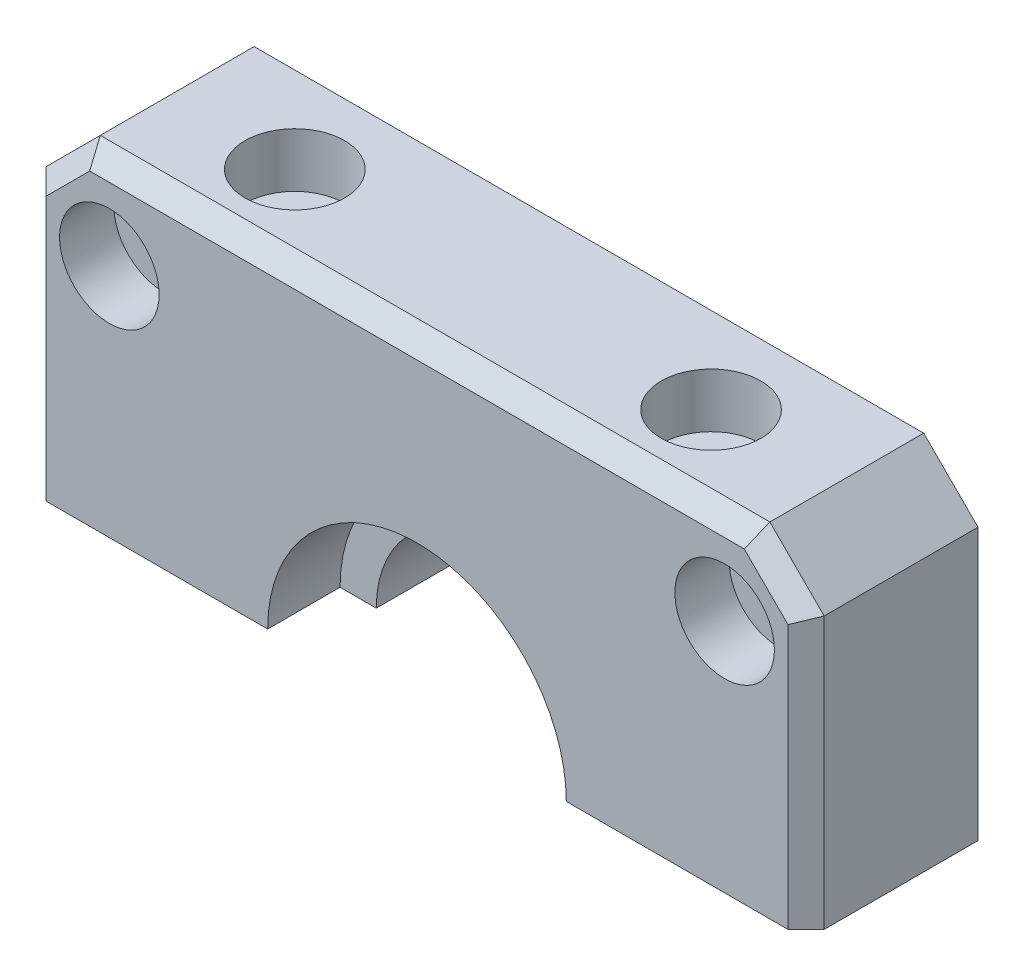
ISO-10303-21;
HEADER;
FILE_DESCRIPTION(('STEP AP214'),'2;1');
FILE_NAME('part.step','',(''),(''),'','','');
FILE_SCHEMA(('AUTOMOTIVE_DESIGN { 1 0 10303 214 1 1 1 1 }'));
ENDSEC;
DATA;
#1=APPLICATION_CONTEXT('core data for automotive mechanical design processes');
#2=APPLICATION_PROTOCOL_DEFINITION('international standard','automotive_design',2000,#1);
#3=PRODUCT_CONTEXT('',#1,'mechanical');
#4=PRODUCT('Part','Part','',(#3));
#5=PRODUCT_RELATED_PRODUCT_CATEGORY('part','',(#4));
#6=PRODUCT_DEFINITION_FORMATION('','',#4);
#7=PRODUCT_DEFINITION_CONTEXT('part definition',#1,'design');
#8=PRODUCT_DEFINITION('design','',#6,#7);
#9=PRODUCT_DEFINITION_SHAPE('','',#8);
#10=(LENGTH_UNIT() NAMED_UNIT(*) SI_UNIT(.MILLI.,.METRE.));
#11=(NAMED_UNIT(*) PLANE_ANGLE_UNIT() SI_UNIT($,.RADIAN.));
#12=(NAMED_UNIT(*) SI_UNIT($,.STERADIAN.) SOLID_ANGLE_UNIT());
#13=UNCERTAINTY_MEASURE_WITH_UNIT(LENGTH_MEASURE(1.E-05),#10,'distance_accuracy_value','');
#14=(GEOMETRIC_REPRESENTATION_CONTEXT(3) GLOBAL_UNCERTAINTY_ASSIGNED_CONTEXT((#13)) GLOBAL_UNIT_ASSIGNED_CONTEXT((#10,
#11,#12)) REPRESENTATION_CONTEXT('',''));
#15=CARTESIAN_POINT('',(0.,0.,0.));
#16=DIRECTION('',(0.,0.,1.));
#17=DIRECTION('',(1.,0.,0.));
#18=AXIS2_PLACEMENT_3D('',#15,#16,#17);
#19=CARTESIAN_POINT('',(-11.5,18.,53.75));
#20=DIRECTION('',(0.,-1.,0.));
#21=DIRECTION('',(1.,0.,0.));
#22=AXIS2_PLACEMENT_3D('',#19,#20,#21);
#23=CYLINDRICAL_SURFACE('',#22,1.5);
#24=CARTESIAN_POINT('',(-11.5,0.,53.75));
#25=DIRECTION('',(0.,-1.,0.));
#26=DIRECTION('',(1.,0.,0.));
#27=AXIS2_PLACEMENT_3D('',#24,#25,#26);
#28=CIRCLE('',#27,1.5);
#29=CARTESIAN_POINT('',(-10.,0.,53.75));
#30=VERTEX_POINT('',#29);
#31=EDGE_CURVE('E293',#30,#30,#28,.T.);
#32=ORIENTED_EDGE('',*,*,#31,.T.);
#33=EDGE_LOOP('',(#32));
#34=FACE_BOUND('',#33,.T.);
#35=CARTESIAN_POINT('',(-11.5,15.,53.75));
#36=DIRECTION('',(0.,1.,0.));
#37=DIRECTION('',(0.,0.,1.));
#38=AXIS2_PLACEMENT_3D('',#35,#36,#37);
#39=CIRCLE('',#38,1.5);
#40=CARTESIAN_POINT('',(-11.5,15.,55.25));
#41=VERTEX_POINT('',#40);
#42=EDGE_CURVE('E232',#41,#41,#39,.F.);
#43=ORIENTED_EDGE('',*,*,#42,.F.);
#44=EDGE_LOOP('',(#43));
#45=FACE_BOUND('',#44,.T.);
#46=ADVANCED_FACE('F39',(#34,#45),#23,.F.);
#47=CARTESIAN_POINT('',(11.5,18.,53.75));
#48=DIRECTION('',(0.,-1.,0.));
#49=DIRECTION('',(1.,0.,0.));
#50=AXIS2_PLACEMENT_3D('',#47,#48,#49);
#51=CYLINDRICAL_SURFACE('',#50,1.5);
#52=CARTESIAN_POINT('',(11.5,0.,53.75));
#53=DIRECTION('',(0.,-1.,0.));
#54=DIRECTION('',(-1.,0.,0.));
#55=AXIS2_PLACEMENT_3D('',#52,#53,#54);
#56=CIRCLE('',#55,1.5);
#57=CARTESIAN_POINT('',(10.,0.,53.75));
#58=VERTEX_POINT('',#57);
#59=EDGE_CURVE('E220',#58,#58,#56,.T.);
#60=ORIENTED_EDGE('',*,*,#59,.T.);
#61=EDGE_LOOP('',(#60));
#62=FACE_BOUND('',#61,.T.);
#63=CARTESIAN_POINT('',(11.5,15.,53.75));
#64=DIRECTION('',(0.,1.,0.));
#65=DIRECTION('',(0.,0.,1.));
#66=AXIS2_PLACEMENT_3D('',#63,#64,#65);
#67=CIRCLE('',#66,1.5);
#68=CARTESIAN_POINT('',(11.5,15.,55.25));
#69=VERTEX_POINT('',#68);
#70=EDGE_CURVE('E227',#69,#69,#67,.F.);
#71=ORIENTED_EDGE('',*,*,#70,.F.);
#72=EDGE_LOOP('',(#71));
#73=FACE_BOUND('',#72,.T.);
#74=ADVANCED_FACE('F353',(#62,#73),#51,.F.);
#75=CARTESIAN_POINT('',(17.,13.,58.5));
#76=DIRECTION('',(0.,0.,-1.));
#77=DIRECTION('',(-1.,0.,0.));
#78=AXIS2_PLACEMENT_3D('',#75,#76,#77);
#79=CYLINDRICAL_SURFACE('',#78,1.5);
#80=CARTESIAN_POINT('',(17.,13.,49.));
#81=DIRECTION('',(0.,0.,1.));
#82=DIRECTION('',(1.,0.,0.));
#83=AXIS2_PLACEMENT_3D('',#80,#81,#82);
#84=CIRCLE('',#83,1.5);
#85=CARTESIAN_POINT('',(18.5,13.,49.));
#86=VERTEX_POINT('',#85);
#87=EDGE_CURVE('E173',#86,#86,#84,.T.);
#88=ORIENTED_EDGE('',*,*,#87,.F.);
#89=EDGE_LOOP('',(#88));
#90=FACE_BOUND('',#89,.T.);
#91=CARTESIAN_POINT('',(17.,13.,55.5));
#92=DIRECTION('',(0.,0.,1.));
#93=DIRECTION('',(1.,0.,0.));
#94=AXIS2_PLACEMENT_3D('',#91,#92,#93);
#95=CIRCLE('',#94,1.5);
#96=CARTESIAN_POINT('',(18.5,13.,55.5));
#97=VERTEX_POINT('',#96);
#98=EDGE_CURVE('E222',#97,#97,#95,.T.);
#99=ORIENTED_EDGE('',*,*,#98,.T.);
#100=EDGE_LOOP('',(#99));
#101=FACE_BOUND('',#100,.T.);
#102=ADVANCED_FACE('F358',(#90,#101),#79,.F.);
#103=CARTESIAN_POINT('',(-17.,13.,58.5));
#104=DIRECTION('',(0.,0.,-1.));
#105=DIRECTION('',(-1.,0.,0.));
#106=AXIS2_PLACEMENT_3D('',#103,#104,#105);
#107=CYLINDRICAL_SURFACE('',#106,1.5);
#108=CARTESIAN_POINT('',(-17.,13.,49.));
#109=DIRECTION('',(0.,0.,1.));
#110=DIRECTION('',(1.,0.,0.));
#111=AXIS2_PLACEMENT_3D('',#108,#109,#110);
#112=CIRCLE('',#111,1.5);
#113=CARTESIAN_POINT('',(-15.5,13.,49.));
#114=VERTEX_POINT('',#113);
#115=EDGE_CURVE('E170',#114,#114,#112,.T.);
#116=ORIENTED_EDGE('',*,*,#115,.F.);
#117=EDGE_LOOP('',(#116));
#118=FACE_BOUND('',#117,.T.);
#119=CARTESIAN_POINT('',(-17.,13.,55.5));
#120=DIRECTION('',(0.,0.,1.));
#121=DIRECTION('',(1.,0.,0.));
#122=AXIS2_PLACEMENT_3D('',#119,#120,#121);
#123=CIRCLE('',#122,1.5);
#124=CARTESIAN_POINT('',(-15.5,13.,55.5));
#125=VERTEX_POINT('',#124);
#126=EDGE_CURVE('E217',#125,#125,#123,.T.);
#127=ORIENTED_EDGE('',*,*,#126,.T.);
#128=EDGE_LOOP('',(#127));
#129=FACE_BOUND('',#128,.T.);
#130=ADVANCED_FACE('F369',(#118,#129),#107,.F.);
#131=CARTESIAN_POINT('',(0.,0.,58.5));
#132=DIRECTION('',(0.,0.,-1.));
#133=DIRECTION('',(-1.,0.,0.));
#134=AXIS2_PLACEMENT_3D('',#131,#132,#133);
#135=CYLINDRICAL_SURFACE('',#134,6.25);
#136=CARTESIAN_POINT('',(0.,0.,54.5));
#137=DIRECTION('',(0.,0.,1.));
#138=DIRECTION('',(1.,0.,0.));
#139=AXIS2_PLACEMENT_3D('',#136,#137,#138);
#140=CIRCLE('',#139,6.25);
#141=CARTESIAN_POINT('',(-6.25,0.,54.5));
#142=VERTEX_POINT('',#141);
#143=CARTESIAN_POINT('',(6.25,0.,54.5));
#144=VERTEX_POINT('',#143);
#145=EDGE_CURVE('E142',#142,#144,#140,.F.);
#146=ORIENTED_EDGE('',*,*,#145,.F.);
#147=DIRECTION('',(0.,0.,-1.));
#148=VECTOR('',#147,1.);
#149=CARTESIAN_POINT('',(-6.25,0.,58.5));
#150=LINE('',#149,#148);
#151=CARTESIAN_POINT('',(-6.25,0.,49.));
#152=VERTEX_POINT('',#151);
#153=EDGE_CURVE('E205',#142,#152,#150,.T.);
#154=ORIENTED_EDGE('',*,*,#153,.T.);
#155=CARTESIAN_POINT('',(0.,0.,49.));
#156=DIRECTION('',(0.,0.,-1.));
#157=DIRECTION('',(1.,0.,0.));
#158=AXIS2_PLACEMENT_3D('',#155,#156,#157);
#159=CIRCLE('',#158,6.25);
#160=CARTESIAN_POINT('',(6.25,0.,49.));
#161=VERTEX_POINT('',#160);
#162=EDGE_CURVE('E192',#152,#161,#159,.T.);
#163=ORIENTED_EDGE('',*,*,#162,.T.);
#164=DIRECTION('',(0.,0.,-1.));
#165=VECTOR('',#164,1.);
#166=CARTESIAN_POINT('',(6.25,0.,58.5));
#167=LINE('',#166,#165);
#168=EDGE_CURVE('E203',#144,#161,#167,.T.);
#169=ORIENTED_EDGE('',*,*,#168,.F.);
#170=EDGE_LOOP('',(#146,#154,#163,#169));
#171=FACE_BOUND('',#170,.T.);
#172=ADVANCED_FACE('F304',(#171),#135,.F.);
#173=CARTESIAN_POINT('',(0.,18.,40.));
#174=DIRECTION('',(0.,-1.,0.));
#175=DIRECTION('',(0.,0.,-1.));
#176=AXIS2_PLACEMENT_3D('',#173,#174,#175);
#177=PLANE('',#176);
#178=CARTESIAN_POINT('',(-11.5,18.,53.75));
#179=DIRECTION('',(0.,1.,0.));
#180=DIRECTION('',(0.,0.,1.));
#181=AXIS2_PLACEMENT_3D('',#178,#179,#180);
#182=CIRCLE('',#181,2.75);
#183=CARTESIAN_POINT('',(-11.5,18.,56.5));
#184=VERTEX_POINT('',#183);
#185=EDGE_CURVE('E268',#184,#184,#182,.T.);
#186=ORIENTED_EDGE('',*,*,#185,.F.);
#187=EDGE_LOOP('',(#186));
#188=FACE_BOUND('',#187,.T.);
#189=CARTESIAN_POINT('',(11.5,18.,53.75));
#190=DIRECTION('',(0.,1.,0.));
#191=DIRECTION('',(0.,0.,1.));
#192=AXIS2_PLACEMENT_3D('',#189,#190,#191);
#193=CIRCLE('',#192,2.75);
#194=CARTESIAN_POINT('',(11.5,18.,56.5));
#195=VERTEX_POINT('',#194);
#196=EDGE_CURVE('E235',#195,#195,#193,.T.);
#197=ORIENTED_EDGE('',*,*,#196,.F.);
#198=EDGE_LOOP('',(#197));
#199=FACE_BOUND('',#198,.T.);
#200=DIRECTION('',(0.,0.,1.));
#201=VECTOR('',#200,1.);
#202=CARTESIAN_POINT('',(-18.5,18.,40.));
#203=LINE('',#202,#201);
#204=CARTESIAN_POINT('',(-18.5,18.,49.));
#205=VERTEX_POINT('',#204);
#206=CARTESIAN_POINT('',(-18.5,18.,57.5));
#207=VERTEX_POINT('',#206);
#208=EDGE_CURVE('E201',#205,#207,#203,.T.);
#209=ORIENTED_EDGE('',*,*,#208,.T.);
#210=DIRECTION('',(1.,0.,0.));
#211=VECTOR('',#210,1.);
#212=CARTESIAN_POINT('',(18.5,18.,57.5));
#213=LINE('',#212,#211);
#214=CARTESIAN_POINT('',(18.5,18.,57.5));
#215=VERTEX_POINT('',#214);
#216=EDGE_CURVE('E12',#207,#215,#213,.T.);
#217=ORIENTED_EDGE('',*,*,#216,.T.);
#218=DIRECTION('',(0.,0.,-1.));
#219=VECTOR('',#218,1.);
#220=CARTESIAN_POINT('',(18.5,18.,20.));
#221=LINE('',#220,#219);
#222=CARTESIAN_POINT('',(18.5,18.,49.));
#223=VERTEX_POINT('',#222);
#224=EDGE_CURVE('E214',#215,#223,#221,.T.);
#225=ORIENTED_EDGE('',*,*,#224,.T.);
#226=DIRECTION('',(-1.,0.,0.));
#227=VECTOR('',#226,1.);
#228=CARTESIAN_POINT('',(0.,18.,49.));
#229=LINE('',#228,#227);
#230=EDGE_CURVE('E180',#223,#205,#229,.T.);
#231=ORIENTED_EDGE('',*,*,#230,.T.);
#232=EDGE_LOOP('',(#209,#217,#225,#231));
#233=FACE_BOUND('',#232,.T.);
#234=ADVANCED_FACE('F335',(#188,#199,#233),#177,.F.);
#235=CARTESIAN_POINT('',(-21.5,0.,40.));
#236=DIRECTION('',(1.,0.,0.));
#237=DIRECTION('',(0.,1.,0.));
#238=AXIS2_PLACEMENT_3D('',#235,#236,#237);
#239=PLANE('',#238);
#240=DIRECTION('',(0.,0.,-1.));
#241=VECTOR('',#240,1.);
#242=CARTESIAN_POINT('',(-21.5,0.,58.5));
#243=LINE('',#242,#241);
#244=CARTESIAN_POINT('',(-21.5,0.,57.5));
#245=VERTEX_POINT('',#244);
#246=CARTESIAN_POINT('',(-21.5,0.,49.));
#247=VERTEX_POINT('',#246);
#248=EDGE_CURVE('E207',#245,#247,#243,.T.);
#249=ORIENTED_EDGE('',*,*,#248,.F.);
#250=DIRECTION('',(0.,1.,0.));
#251=VECTOR('',#250,1.);
#252=CARTESIAN_POINT('',(-21.5,15.,57.5));
#253=LINE('',#252,#251);
#254=CARTESIAN_POINT('',(-21.5,15.,57.5));
#255=VERTEX_POINT('',#254);
#256=EDGE_CURVE('E63',#245,#255,#253,.T.);
#257=ORIENTED_EDGE('',*,*,#256,.T.);
#258=DIRECTION('',(0.,0.,-1.));
#259=VECTOR('',#258,1.);
#260=CARTESIAN_POINT('',(-21.5,15.,40.));
#261=LINE('',#260,#259);
#262=CARTESIAN_POINT('',(-21.5,15.,49.));
#263=VERTEX_POINT('',#262);
#264=EDGE_CURVE('E212',#255,#263,#261,.T.);
#265=ORIENTED_EDGE('',*,*,#264,.T.);
#266=DIRECTION('',(0.,-1.,0.));
#267=VECTOR('',#266,1.);
#268=CARTESIAN_POINT('',(-21.5,0.,49.));
#269=LINE('',#268,#267);
#270=EDGE_CURVE('E181',#263,#247,#269,.T.);
#271=ORIENTED_EDGE('',*,*,#270,.T.);
#272=EDGE_LOOP('',(#249,#257,#265,#271));
#273=FACE_BOUND('',#272,.T.);
#274=ADVANCED_FACE('F340',(#273),#239,.F.);
#275=CARTESIAN_POINT('',(21.5,0.,40.));
#276=DIRECTION('',(1.,0.,0.));
#277=DIRECTION('',(0.,1.,0.));
#278=AXIS2_PLACEMENT_3D('',#275,#276,#277);
#279=PLANE('',#278);
#280=DIRECTION('',(0.,0.,1.));
#281=VECTOR('',#280,1.);
#282=CARTESIAN_POINT('',(21.5,15.,49.));
#283=LINE('',#282,#281);
#284=CARTESIAN_POINT('',(21.5,15.,49.));
#285=VERTEX_POINT('',#284);
#286=CARTESIAN_POINT('',(21.5,15.,57.5));
#287=VERTEX_POINT('',#286);
#288=EDGE_CURVE('E209',#285,#287,#283,.T.);
#289=ORIENTED_EDGE('',*,*,#288,.T.);
#290=DIRECTION('',(0.,-1.,0.));
#291=VECTOR('',#290,1.);
#292=CARTESIAN_POINT('',(21.5,0.,57.5));
#293=LINE('',#292,#291);
#294=CARTESIAN_POINT('',(21.5,0.,57.5));
#295=VERTEX_POINT('',#294);
#296=EDGE_CURVE('E247',#287,#295,#293,.T.);
#297=ORIENTED_EDGE('',*,*,#296,.T.);
#298=DIRECTION('',(0.,0.,-1.));
#299=VECTOR('',#298,1.);
#300=CARTESIAN_POINT('',(21.5,0.,58.5));
#301=LINE('',#300,#299);
#302=CARTESIAN_POINT('',(21.5,0.,49.));
#303=VERTEX_POINT('',#302);
#304=EDGE_CURVE('E194',#295,#303,#301,.T.);
#305=ORIENTED_EDGE('',*,*,#304,.T.);
#306=DIRECTION('',(0.,-1.,0.));
#307=VECTOR('',#306,1.);
#308=CARTESIAN_POINT('',(21.5,0.,49.));
#309=LINE('',#308,#307);
#310=EDGE_CURVE('E177',#285,#303,#309,.T.);
#311=ORIENTED_EDGE('',*,*,#310,.F.);
#312=EDGE_LOOP('',(#289,#297,#305,#311));
#313=FACE_BOUND('',#312,.T.);
#314=ADVANCED_FACE('F316',(#313),#279,.T.);
#315=CARTESIAN_POINT('',(-21.5,15.,40.));
#316=DIRECTION('',(0.707106781186547,-0.707106781186548,0.));
#317=DIRECTION('',(0.,0.,-1.));
#318=AXIS2_PLACEMENT_3D('',#315,#316,#317);
#319=PLANE('',#318);
#320=ORIENTED_EDGE('',*,*,#264,.F.);
#321=DIRECTION('',(-0.707106781186548,-0.707106781186547,0.));
#322=VECTOR('',#321,1.);
#323=CARTESIAN_POINT('',(-21.5,15.,57.5));
#324=LINE('',#323,#322);
#325=EDGE_CURVE('E48',#255,#207,#324,.F.);
#326=ORIENTED_EDGE('',*,*,#325,.T.);
#327=ORIENTED_EDGE('',*,*,#208,.F.);
#328=DIRECTION('',(-0.707106781186548,-0.707106781186547,0.));
#329=VECTOR('',#328,1.);
#330=CARTESIAN_POINT('',(-21.5,15.,49.));
#331=LINE('',#330,#329);
#332=EDGE_CURVE('E185',#263,#205,#331,.F.);
#333=ORIENTED_EDGE('',*,*,#332,.F.);
#334=EDGE_LOOP('',(#320,#326,#327,#333));
#335=FACE_BOUND('',#334,.T.);
#336=ADVANCED_FACE('F342',(#335),#319,.F.);
#337=CARTESIAN_POINT('',(18.5,18.,40.));
#338=DIRECTION('',(0.707106781186548,0.707106781186548,0.));
#339=DIRECTION('',(0.,0.,1.));
#340=AXIS2_PLACEMENT_3D('',#337,#338,#339);
#341=PLANE('',#340);
#342=ORIENTED_EDGE('',*,*,#224,.F.);
#343=DIRECTION('',(0.707106781186548,-0.707106781186548,0.));
#344=VECTOR('',#343,1.);
#345=CARTESIAN_POINT('',(18.5,18.,57.5));
#346=LINE('',#345,#344);
#347=EDGE_CURVE('E251',#215,#287,#346,.T.);
#348=ORIENTED_EDGE('',*,*,#347,.T.);
#349=ORIENTED_EDGE('',*,*,#288,.F.);
#350=DIRECTION('',(0.707106781186548,-0.707106781186548,0.));
#351=VECTOR('',#350,1.);
#352=CARTESIAN_POINT('',(18.5,18.,49.));
#353=LINE('',#352,#351);
#354=EDGE_CURVE('E176',#223,#285,#353,.T.);
#355=ORIENTED_EDGE('',*,*,#354,.F.);
#356=EDGE_LOOP('',(#342,#348,#349,#355));
#357=FACE_BOUND('',#356,.T.);
#358=ADVANCED_FACE('F320',(#357),#341,.T.);
#359=CARTESIAN_POINT('',(-6.25,0.,58.5));
#360=DIRECTION('',(0.,1.,0.));
#361=DIRECTION('',(-1.,0.,0.));
#362=AXIS2_PLACEMENT_3D('',#359,#360,#361);
#363=PLANE('',#362);
#364=ORIENTED_EDGE('',*,*,#31,.F.);
#365=EDGE_LOOP('',(#364));
#366=FACE_BOUND('',#365,.T.);
#367=DIRECTION('',(1.,0.,0.));
#368=VECTOR('',#367,1.);
#369=CARTESIAN_POINT('',(-6.25,0.,58.5));
#370=LINE('',#369,#368);
#371=CARTESIAN_POINT('',(-20.5,0.,58.5));
#372=VERTEX_POINT('',#371);
#373=CARTESIAN_POINT('',(-8.25,0.,58.5));
#374=VERTEX_POINT('',#373);
#375=EDGE_CURVE('E190',#372,#374,#370,.T.);
#376=ORIENTED_EDGE('',*,*,#375,.F.);
#377=DIRECTION('',(-0.707106781186545,0.,-0.70710678118655));
#378=VECTOR('',#377,1.);
#379=CARTESIAN_POINT('',(-20.5,0.,58.5));
#380=LINE('',#379,#378);
#381=EDGE_CURVE('E253',#372,#245,#380,.T.);
#382=ORIENTED_EDGE('',*,*,#381,.T.);
#383=ORIENTED_EDGE('',*,*,#248,.T.);
#384=DIRECTION('',(1.,0.,0.));
#385=VECTOR('',#384,1.);
#386=CARTESIAN_POINT('',(-6.25,0.,49.));
#387=LINE('',#386,#385);
#388=EDGE_CURVE('E184',#247,#152,#387,.T.);
#389=ORIENTED_EDGE('',*,*,#388,.T.);
#390=ORIENTED_EDGE('',*,*,#153,.F.);
#391=DIRECTION('',(1.,0.,0.));
#392=VECTOR('',#391,1.);
#393=CARTESIAN_POINT('',(-6.25,0.,54.5));
#394=LINE('',#393,#392);
#395=CARTESIAN_POINT('',(-8.25,0.,54.5));
#396=VERTEX_POINT('',#395);
#397=EDGE_CURVE('E168',#396,#142,#394,.T.);
#398=ORIENTED_EDGE('',*,*,#397,.F.);
#399=DIRECTION('',(0.,0.,1.));
#400=VECTOR('',#399,1.);
#401=CARTESIAN_POINT('',(-8.25,0.,54.5));
#402=LINE('',#401,#400);
#403=EDGE_CURVE('E155',#396,#374,#402,.T.);
#404=ORIENTED_EDGE('',*,*,#403,.T.);
#405=EDGE_LOOP('',(#376,#382,#383,#389,#390,#398,#404));
#406=FACE_BOUND('',#405,.T.);
#407=ADVANCED_FACE('F300',(#366,#406),#363,.F.);
#408=CARTESIAN_POINT('',(21.5,0.,58.5));
#409=DIRECTION('',(0.,1.,0.));
#410=DIRECTION('',(-1.,0.,0.));
#411=AXIS2_PLACEMENT_3D('',#408,#409,#410);
#412=PLANE('',#411);
#413=ORIENTED_EDGE('',*,*,#59,.F.);
#414=EDGE_LOOP('',(#413));
#415=FACE_BOUND('',#414,.T.);
#416=ORIENTED_EDGE('',*,*,#304,.F.);
#417=DIRECTION('',(0.707106781186545,0.,-0.70710678118655));
#418=VECTOR('',#417,1.);
#419=CARTESIAN_POINT('',(20.5,0.,58.5));
#420=LINE('',#419,#418);
#421=CARTESIAN_POINT('',(20.5,0.,58.5));
#422=VERTEX_POINT('',#421);
#423=EDGE_CURVE('E249',#295,#422,#420,.F.);
#424=ORIENTED_EDGE('',*,*,#423,.T.);
#425=DIRECTION('',(1.,0.,0.));
#426=VECTOR('',#425,1.);
#427=CARTESIAN_POINT('',(21.5,0.,58.5));
#428=LINE('',#427,#426);
#429=CARTESIAN_POINT('',(8.25,0.,58.5));
#430=VERTEX_POINT('',#429);
#431=EDGE_CURVE('E162',#430,#422,#428,.T.);
#432=ORIENTED_EDGE('',*,*,#431,.F.);
#433=DIRECTION('',(0.,0.,1.));
#434=VECTOR('',#433,1.);
#435=CARTESIAN_POINT('',(8.25,0.,54.5));
#436=LINE('',#435,#434);
#437=CARTESIAN_POINT('',(8.25,0.,54.5));
#438=VERTEX_POINT('',#437);
#439=EDGE_CURVE('E152',#430,#438,#436,.F.);
#440=ORIENTED_EDGE('',*,*,#439,.T.);
#441=DIRECTION('',(1.,0.,0.));
#442=VECTOR('',#441,1.);
#443=CARTESIAN_POINT('',(21.5,0.,54.5));
#444=LINE('',#443,#442);
#445=EDGE_CURVE('E136',#144,#438,#444,.T.);
#446=ORIENTED_EDGE('',*,*,#445,.F.);
#447=ORIENTED_EDGE('',*,*,#168,.T.);
#448=DIRECTION('',(1.,0.,0.));
#449=VECTOR('',#448,1.);
#450=CARTESIAN_POINT('',(21.5,0.,49.));
#451=LINE('',#450,#449);
#452=EDGE_CURVE('E147',#161,#303,#451,.T.);
#453=ORIENTED_EDGE('',*,*,#452,.T.);
#454=EDGE_LOOP('',(#416,#424,#432,#440,#446,#447,#453));
#455=FACE_BOUND('',#454,.T.);
#456=ADVANCED_FACE('F160',(#415,#455),#412,.F.);
#457=CARTESIAN_POINT('',(0.,0.,58.5));
#458=DIRECTION('',(0.,0.,1.));
#459=DIRECTION('',(1.,0.,0.));
#460=AXIS2_PLACEMENT_3D('',#457,#458,#459);
#461=PLANE('',#460);
#462=ORIENTED_EDGE('',*,*,#431,.T.);
#463=DIRECTION('',(0.,1.,0.));
#464=VECTOR('',#463,1.);
#465=CARTESIAN_POINT('',(20.5,0.,58.5));
#466=LINE('',#465,#464);
#467=CARTESIAN_POINT('',(20.5,14.5857864376269,58.5));
#468=VERTEX_POINT('',#467);
#469=EDGE_CURVE('E244',#422,#468,#466,.T.);
#470=ORIENTED_EDGE('',*,*,#469,.T.);
#471=DIRECTION('',(-0.707106781186548,0.707106781186548,0.));
#472=VECTOR('',#471,1.);
#473=CARTESIAN_POINT('',(17.5428932188135,17.5428932188135,58.5));
#474=LINE('',#473,#472);
#475=CARTESIAN_POINT('',(18.0857864376269,17.,58.5));
#476=VERTEX_POINT('',#475);
#477=EDGE_CURVE('E242',#468,#476,#474,.T.);
#478=ORIENTED_EDGE('',*,*,#477,.T.);
#479=DIRECTION('',(-1.,0.,0.));
#480=VECTOR('',#479,1.);
#481=CARTESIAN_POINT('',(-18.5,17.,58.5));
#482=LINE('',#481,#480);
#483=CARTESIAN_POINT('',(-18.0857864376269,17.,58.5));
#484=VERTEX_POINT('',#483);
#485=EDGE_CURVE('E146',#476,#484,#482,.T.);
#486=ORIENTED_EDGE('',*,*,#485,.T.);
#487=DIRECTION('',(-0.707106781186548,-0.707106781186547,0.));
#488=VECTOR('',#487,1.);
#489=CARTESIAN_POINT('',(-17.5428932188135,17.5428932188135,58.5));
#490=LINE('',#489,#488);
#491=CARTESIAN_POINT('',(-20.5,14.5857864376269,58.5));
#492=VERTEX_POINT('',#491);
#493=EDGE_CURVE('E238',#484,#492,#490,.T.);
#494=ORIENTED_EDGE('',*,*,#493,.T.);
#495=DIRECTION('',(0.,-1.,0.));
#496=VECTOR('',#495,1.);
#497=CARTESIAN_POINT('',(-20.5,0.,58.5));
#498=LINE('',#497,#496);
#499=EDGE_CURVE('E240',#492,#372,#498,.T.);
#500=ORIENTED_EDGE('',*,*,#499,.T.);
#501=ORIENTED_EDGE('',*,*,#375,.T.);
#502=CARTESIAN_POINT('',(0.,0.,58.5));
#503=DIRECTION('',(0.,0.,1.));
#504=DIRECTION('',(1.,0.,0.));
#505=AXIS2_PLACEMENT_3D('',#502,#503,#504);
#506=CIRCLE('',#505,8.25);
#507=EDGE_CURVE('E156',#430,#374,#506,.T.);
#508=ORIENTED_EDGE('',*,*,#507,.F.);
#509=EDGE_LOOP('',(#462,#470,#478,#486,#494,#500,#501,#508));
#510=FACE_BOUND('',#509,.T.);
#511=CARTESIAN_POINT('',(17.,13.,58.5));
#512=DIRECTION('',(0.,0.,1.));
#513=DIRECTION('',(1.,0.,0.));
#514=AXIS2_PLACEMENT_3D('',#511,#512,#513);
#515=CIRCLE('',#514,2.75);
#516=CARTESIAN_POINT('',(19.75,13.,58.5));
#517=VERTEX_POINT('',#516);
#518=EDGE_CURVE('E230',#517,#517,#515,.T.);
#519=ORIENTED_EDGE('',*,*,#518,.F.);
#520=EDGE_LOOP('',(#519));
#521=FACE_BOUND('',#520,.T.);
#522=CARTESIAN_POINT('',(-17.,13.,58.5));
#523=DIRECTION('',(0.,0.,1.));
#524=DIRECTION('',(1.,0.,0.));
#525=AXIS2_PLACEMENT_3D('',#522,#523,#524);
#526=CIRCLE('',#525,2.75);
#527=CARTESIAN_POINT('',(-14.25,13.,58.5));
#528=VERTEX_POINT('',#527);
#529=EDGE_CURVE('E225',#528,#528,#526,.T.);
#530=ORIENTED_EDGE('',*,*,#529,.F.);
#531=EDGE_LOOP('',(#530));
#532=FACE_BOUND('',#531,.T.);
#533=ADVANCED_FACE('F331',(#510,#521,#532),#461,.T.);
#534=CARTESIAN_POINT('',(0.,0.,49.));
#535=DIRECTION('',(0.,0.,1.));
#536=DIRECTION('',(1.,0.,0.));
#537=AXIS2_PLACEMENT_3D('',#534,#535,#536);
#538=PLANE('',#537);
#539=ORIENTED_EDGE('',*,*,#162,.F.);
#540=ORIENTED_EDGE('',*,*,#388,.F.);
#541=ORIENTED_EDGE('',*,*,#270,.F.);
#542=ORIENTED_EDGE('',*,*,#332,.T.);
#543=ORIENTED_EDGE('',*,*,#230,.F.);
#544=ORIENTED_EDGE('',*,*,#354,.T.);
#545=ORIENTED_EDGE('',*,*,#310,.T.);
#546=ORIENTED_EDGE('',*,*,#452,.F.);
#547=EDGE_LOOP('',(#539,#540,#541,#542,#543,#544,#545,#546));
#548=FACE_BOUND('',#547,.T.);
#549=ORIENTED_EDGE('',*,*,#115,.T.);
#550=EDGE_LOOP('',(#549));
#551=FACE_BOUND('',#550,.T.);
#552=ORIENTED_EDGE('',*,*,#87,.T.);
#553=EDGE_LOOP('',(#552));
#554=FACE_BOUND('',#553,.T.);
#555=ADVANCED_FACE('F308',(#548,#551,#554),#538,.F.);
#556=CARTESIAN_POINT('',(0.,0.,54.5));
#557=DIRECTION('',(0.,0.,1.));
#558=DIRECTION('',(1.,0.,0.));
#559=AXIS2_PLACEMENT_3D('',#556,#557,#558);
#560=PLANE('',#559);
#561=ORIENTED_EDGE('',*,*,#397,.T.);
#562=ORIENTED_EDGE('',*,*,#145,.T.);
#563=ORIENTED_EDGE('',*,*,#445,.T.);
#564=CARTESIAN_POINT('',(0.,0.,54.5));
#565=DIRECTION('',(0.,0.,1.));
#566=DIRECTION('',(1.,0.,0.));
#567=AXIS2_PLACEMENT_3D('',#564,#565,#566);
#568=CIRCLE('',#567,8.25);
#569=EDGE_CURVE('E139',#438,#396,#568,.T.);
#570=ORIENTED_EDGE('',*,*,#569,.T.);
#571=EDGE_LOOP('',(#561,#562,#563,#570));
#572=FACE_BOUND('',#571,.T.);
#573=ADVANCED_FACE('F138',(#572),#560,.T.);
#574=CARTESIAN_POINT('',(0.,0.,54.5));
#575=DIRECTION('',(0.,0.,1.));
#576=DIRECTION('',(1.,0.,0.));
#577=AXIS2_PLACEMENT_3D('',#574,#575,#576);
#578=CYLINDRICAL_SURFACE('',#577,8.25);
#579=ORIENTED_EDGE('',*,*,#569,.F.);
#580=ORIENTED_EDGE('',*,*,#439,.F.);
#581=ORIENTED_EDGE('',*,*,#507,.T.);
#582=ORIENTED_EDGE('',*,*,#403,.F.);
#583=EDGE_LOOP('',(#579,#580,#581,#582));
#584=FACE_BOUND('',#583,.T.);
#585=ADVANCED_FACE('F150',(#584),#578,.F.);
#586=CARTESIAN_POINT('',(-17.,13.,55.5));
#587=DIRECTION('',(0.,0.,1.));
#588=DIRECTION('',(1.,0.,0.));
#589=AXIS2_PLACEMENT_3D('',#586,#587,#588);
#590=CYLINDRICAL_SURFACE('',#589,2.75);
#591=CARTESIAN_POINT('',(-17.,13.,55.5));
#592=DIRECTION('',(0.,0.,1.));
#593=DIRECTION('',(1.,0.,0.));
#594=AXIS2_PLACEMENT_3D('',#591,#592,#593);
#595=CIRCLE('',#594,2.75);
#596=CARTESIAN_POINT('',(-14.25,13.,55.5));
#597=VERTEX_POINT('',#596);
#598=EDGE_CURVE('E221',#597,#597,#595,.T.);
#599=ORIENTED_EDGE('',*,*,#598,.F.);
#600=EDGE_LOOP('',(#599));
#601=FACE_BOUND('',#600,.T.);
#602=ORIENTED_EDGE('',*,*,#529,.T.);
#603=EDGE_LOOP('',(#602));
#604=FACE_BOUND('',#603,.T.);
#605=ADVANCED_FACE('F368',(#601,#604),#590,.F.);
#606=CARTESIAN_POINT('',(-17.,13.,55.5));
#607=DIRECTION('',(0.,0.,1.));
#608=DIRECTION('',(1.,0.,0.));
#609=AXIS2_PLACEMENT_3D('',#606,#607,#608);
#610=PLANE('',#609);
#611=ORIENTED_EDGE('',*,*,#126,.F.);
#612=EDGE_LOOP('',(#611));
#613=FACE_BOUND('',#612,.T.);
#614=ORIENTED_EDGE('',*,*,#598,.T.);
#615=EDGE_LOOP('',(#614));
#616=FACE_BOUND('',#615,.T.);
#617=ADVANCED_FACE('F421',(#613,#616),#610,.T.);
#618=CARTESIAN_POINT('',(17.,13.,55.5));
#619=DIRECTION('',(0.,0.,1.));
#620=DIRECTION('',(1.,0.,0.));
#621=AXIS2_PLACEMENT_3D('',#618,#619,#620);
#622=CYLINDRICAL_SURFACE('',#621,2.75);
#623=CARTESIAN_POINT('',(17.,13.,55.5));
#624=DIRECTION('',(0.,0.,1.));
#625=DIRECTION('',(1.,0.,0.));
#626=AXIS2_PLACEMENT_3D('',#623,#624,#625);
#627=CIRCLE('',#626,2.75);
#628=CARTESIAN_POINT('',(19.75,13.,55.5));
#629=VERTEX_POINT('',#628);
#630=EDGE_CURVE('E226',#629,#629,#627,.T.);
#631=ORIENTED_EDGE('',*,*,#630,.F.);
#632=EDGE_LOOP('',(#631));
#633=FACE_BOUND('',#632,.T.);
#634=ORIENTED_EDGE('',*,*,#518,.T.);
#635=EDGE_LOOP('',(#634));
#636=FACE_BOUND('',#635,.T.);
#637=ADVANCED_FACE('F417',(#633,#636),#622,.F.);
#638=CARTESIAN_POINT('',(17.,13.,55.5));
#639=DIRECTION('',(0.,0.,1.));
#640=DIRECTION('',(1.,0.,0.));
#641=AXIS2_PLACEMENT_3D('',#638,#639,#640);
#642=PLANE('',#641);
#643=ORIENTED_EDGE('',*,*,#98,.F.);
#644=EDGE_LOOP('',(#643));
#645=FACE_BOUND('',#644,.T.);
#646=ORIENTED_EDGE('',*,*,#630,.T.);
#647=EDGE_LOOP('',(#646));
#648=FACE_BOUND('',#647,.T.);
#649=ADVANCED_FACE('F409',(#645,#648),#642,.T.);
#650=CARTESIAN_POINT('',(11.5,15.,53.75));
#651=DIRECTION('',(0.,1.,0.));
#652=DIRECTION('',(0.,0.,1.));
#653=AXIS2_PLACEMENT_3D('',#650,#651,#652);
#654=PLANE('',#653);
#655=CARTESIAN_POINT('',(11.5,15.,53.75));
#656=DIRECTION('',(0.,1.,0.));
#657=DIRECTION('',(0.,0.,1.));
#658=AXIS2_PLACEMENT_3D('',#655,#656,#657);
#659=CIRCLE('',#658,2.75);
#660=CARTESIAN_POINT('',(11.5,15.,56.5));
#661=VERTEX_POINT('',#660);
#662=EDGE_CURVE('E231',#661,#661,#659,.T.);
#663=ORIENTED_EDGE('',*,*,#662,.T.);
#664=EDGE_LOOP('',(#663));
#665=FACE_BOUND('',#664,.T.);
#666=ORIENTED_EDGE('',*,*,#70,.T.);
#667=EDGE_LOOP('',(#666));
#668=FACE_BOUND('',#667,.T.);
#669=ADVANCED_FACE('F399',(#665,#668),#654,.T.);
#670=CARTESIAN_POINT('',(11.5,15.,53.75));
#671=DIRECTION('',(0.,1.,0.));
#672=DIRECTION('',(0.,0.,1.));
#673=AXIS2_PLACEMENT_3D('',#670,#671,#672);
#674=CYLINDRICAL_SURFACE('',#673,2.75);
#675=CARTESIAN_POINT('',(11.5,15.,56.5));
#676=CARTESIAN_POINT('',(11.5,15.03125,56.5));
#677=CARTESIAN_POINT('',(11.5,15.0625,56.5));
#678=CARTESIAN_POINT('',(11.5,15.125,56.5));
#679=CARTESIAN_POINT('',(11.5,15.15625,56.5));
#680=CARTESIAN_POINT('',(11.5,15.21875,56.5));
#681=CARTESIAN_POINT('',(11.5,15.25,56.5));
#682=CARTESIAN_POINT('',(11.5,15.3125,56.5));
#683=CARTESIAN_POINT('',(11.5,15.34375,56.5));
#684=CARTESIAN_POINT('',(11.5,15.40625,56.5));
#685=CARTESIAN_POINT('',(11.5,15.4375,56.5));
#686=CARTESIAN_POINT('',(11.5,15.5,56.5));
#687=CARTESIAN_POINT('',(11.5,15.53125,56.5));
#688=CARTESIAN_POINT('',(11.5,15.59375,56.5));
#689=CARTESIAN_POINT('',(11.5,15.625,56.5));
#690=CARTESIAN_POINT('',(11.5,15.6875,56.5));
#691=CARTESIAN_POINT('',(11.5,15.71875,56.5));
#692=CARTESIAN_POINT('',(11.5,15.78125,56.5));
#693=CARTESIAN_POINT('',(11.5,15.8125,56.5));
#694=CARTESIAN_POINT('',(11.5,15.875,56.5));
#695=CARTESIAN_POINT('',(11.5,15.90625,56.5));
#696=CARTESIAN_POINT('',(11.5,15.96875,56.5));
#697=CARTESIAN_POINT('',(11.5,16.,56.5));
#698=CARTESIAN_POINT('',(11.5,16.0625,56.5));
#699=CARTESIAN_POINT('',(11.5,16.09375,56.5));
#700=CARTESIAN_POINT('',(11.5,16.15625,56.5));
#701=CARTESIAN_POINT('',(11.5,16.1875,56.5));
#702=CARTESIAN_POINT('',(11.5,16.25,56.5));
#703=CARTESIAN_POINT('',(11.5,16.28125,56.5));
#704=CARTESIAN_POINT('',(11.5,16.34375,56.5));
#705=CARTESIAN_POINT('',(11.5,16.375,56.5));
#706=CARTESIAN_POINT('',(11.5,16.4375,56.5));
#707=CARTESIAN_POINT('',(11.5,16.46875,56.5));
#708=CARTESIAN_POINT('',(11.5,16.53125,56.5));
#709=CARTESIAN_POINT('',(11.5,16.5625,56.5));
#710=CARTESIAN_POINT('',(11.5,16.625,56.5));
#711=CARTESIAN_POINT('',(11.5,16.65625,56.5));
#712=CARTESIAN_POINT('',(11.5,16.71875,56.5));
#713=CARTESIAN_POINT('',(11.5,16.75,56.5));
#714=CARTESIAN_POINT('',(11.5,16.8125,56.5));
#715=CARTESIAN_POINT('',(11.5,16.84375,56.5));
#716=CARTESIAN_POINT('',(11.5,16.90625,56.5));
#717=CARTESIAN_POINT('',(11.5,16.9375,56.5));
#718=CARTESIAN_POINT('',(11.5,17.,56.5));
#719=CARTESIAN_POINT('',(11.5,17.03125,56.5));
#720=CARTESIAN_POINT('',(11.5,17.09375,56.5));
#721=CARTESIAN_POINT('',(11.5,17.125,56.5));
#722=CARTESIAN_POINT('',(11.5,17.1875,56.5));
#723=CARTESIAN_POINT('',(11.5,17.21875,56.5));
#724=CARTESIAN_POINT('',(11.5,17.28125,56.5));
#725=CARTESIAN_POINT('',(11.5,17.3125,56.5));
#726=CARTESIAN_POINT('',(11.5,17.375,56.5));
#727=CARTESIAN_POINT('',(11.5,17.40625,56.5));
#728=CARTESIAN_POINT('',(11.5,17.46875,56.5));
#729=CARTESIAN_POINT('',(11.5,17.5,56.5));
#730=CARTESIAN_POINT('',(11.5,17.5625,56.5));
#731=CARTESIAN_POINT('',(11.5,17.59375,56.5));
#732=CARTESIAN_POINT('',(11.5,17.65625,56.5));
#733=CARTESIAN_POINT('',(11.5,17.6875,56.5));
#734=CARTESIAN_POINT('',(11.5,17.75,56.5));
#735=CARTESIAN_POINT('',(11.5,17.78125,56.5));
#736=CARTESIAN_POINT('',(11.5,17.84375,56.5));
#737=CARTESIAN_POINT('',(11.5,17.875,56.5));
#738=CARTESIAN_POINT('',(11.5,17.9375,56.5));
#739=CARTESIAN_POINT('',(11.5,17.96875,56.5));
#740=CARTESIAN_POINT('',(11.5,18.,56.5));
#741=B_SPLINE_CURVE_WITH_KNOTS('',3,(#675,#676,#677,#678,#679,#680,#681,#682,#683,#684,#685,
#686,#687,#688,#689,#690,#691,#692,#693,#694,#695,#696,#697,#698,#699,#700,#701,#702,#703,#704,
#705,#706,#707,#708,#709,#710,#711,#712,#713,#714,#715,#716,#717,#718,#719,#720,#721,#722,#723,
#724,#725,#726,#727,#728,#729,#730,#731,#732,#733,#734,#735,#736,#737,#738,#739,#740),
.UNSPECIFIED.,.F.,.F.,(4,2,2,2,2,2,2,2,2,2,2,2,2,2,2,2,2,2,2,2,2,2,2,2,2,2,2,2,2,2,2,2,4),(0.,
0.0937499999999983,0.187499999999998,0.281249999999999,0.374999999999999,0.468749999999997,
0.562499999999997,0.656249999999997,0.749999999999997,0.843749999999997,0.937499999999997,
1.03125,1.12499999999999,1.21874999999999,1.31249999999999,1.40624999999999,1.49999999999999,
1.59374999999999,1.68749999999999,1.78124999999999,1.87499999999999,1.96874999999999,
2.06249999999999,2.15624999999999,2.24999999999999,2.34374999999999,2.43749999999999,
2.53124999999999,2.62499999999999,2.71874999999999,2.81249999999999,2.90624999999999,
2.99999999999999),.UNSPECIFIED.);
#742=EDGE_CURVE('BSEAM396',#661,#195,#741,.T.);
#743=ORIENTED_EDGE('',*,*,#662,.F.);
#744=ORIENTED_EDGE('',*,*,#196,.T.);
#745=ORIENTED_EDGE('',*,*,#742,.T.);
#746=ORIENTED_EDGE('',*,*,#742,.F.);
#747=EDGE_LOOP('',(#743,#745,#744,#746));
#748=FACE_BOUND('',#747,.T.);
#749=ADVANCED_FACE('F396',(#748),#674,.F.);
#750=CARTESIAN_POINT('',(-11.5,15.,53.75));
#751=DIRECTION('',(0.,1.,0.));
#752=DIRECTION('',(0.,0.,1.));
#753=AXIS2_PLACEMENT_3D('',#750,#751,#752);
#754=PLANE('',#753);
#755=CARTESIAN_POINT('',(-11.5,15.,53.75));
#756=DIRECTION('',(0.,1.,0.));
#757=DIRECTION('',(0.,0.,1.));
#758=AXIS2_PLACEMENT_3D('',#755,#756,#757);
#759=CIRCLE('',#758,2.75);
#760=CARTESIAN_POINT('',(-11.5,15.,56.5));
#761=VERTEX_POINT('',#760);
#762=EDGE_CURVE('E236',#761,#761,#759,.T.);
#763=ORIENTED_EDGE('',*,*,#762,.T.);
#764=EDGE_LOOP('',(#763));
#765=FACE_BOUND('',#764,.T.);
#766=ORIENTED_EDGE('',*,*,#42,.T.);
#767=EDGE_LOOP('',(#766));
#768=FACE_BOUND('',#767,.T.);
#769=ADVANCED_FACE('F398',(#765,#768),#754,.T.);
#770=CARTESIAN_POINT('',(-11.5,15.,53.75));
#771=DIRECTION('',(0.,1.,0.));
#772=DIRECTION('',(0.,0.,1.));
#773=AXIS2_PLACEMENT_3D('',#770,#771,#772);
#774=CYLINDRICAL_SURFACE('',#773,2.75);
#775=CARTESIAN_POINT('',(-11.5,15.,56.5));
#776=CARTESIAN_POINT('',(-11.5,15.03125,56.5));
#777=CARTESIAN_POINT('',(-11.5,15.0625,56.5));
#778=CARTESIAN_POINT('',(-11.5,15.125,56.5));
#779=CARTESIAN_POINT('',(-11.5,15.15625,56.5));
#780=CARTESIAN_POINT('',(-11.5,15.21875,56.5));
#781=CARTESIAN_POINT('',(-11.5,15.25,56.5));
#782=CARTESIAN_POINT('',(-11.5,15.3125,56.5));
#783=CARTESIAN_POINT('',(-11.5,15.34375,56.5));
#784=CARTESIAN_POINT('',(-11.5,15.40625,56.5));
#785=CARTESIAN_POINT('',(-11.5,15.4375,56.5));
#786=CARTESIAN_POINT('',(-11.5,15.5,56.5));
#787=CARTESIAN_POINT('',(-11.5,15.53125,56.5));
#788=CARTESIAN_POINT('',(-11.5,15.59375,56.5));
#789=CARTESIAN_POINT('',(-11.5,15.625,56.5));
#790=CARTESIAN_POINT('',(-11.5,15.6875,56.5));
#791=CARTESIAN_POINT('',(-11.5,15.71875,56.5));
#792=CARTESIAN_POINT('',(-11.5,15.78125,56.5));
#793=CARTESIAN_POINT('',(-11.5,15.8125,56.5));
#794=CARTESIAN_POINT('',(-11.5,15.875,56.5));
#795=CARTESIAN_POINT('',(-11.5,15.90625,56.5));
#796=CARTESIAN_POINT('',(-11.5,15.96875,56.5));
#797=CARTESIAN_POINT('',(-11.5,16.,56.5));
#798=CARTESIAN_POINT('',(-11.5,16.0625,56.5));
#799=CARTESIAN_POINT('',(-11.5,16.09375,56.5));
#800=CARTESIAN_POINT('',(-11.5,16.15625,56.5));
#801=CARTESIAN_POINT('',(-11.5,16.1875,56.5));
#802=CARTESIAN_POINT('',(-11.5,16.25,56.5));
#803=CARTESIAN_POINT('',(-11.5,16.28125,56.5));
#804=CARTESIAN_POINT('',(-11.5,16.34375,56.5));
#805=CARTESIAN_POINT('',(-11.5,16.375,56.5));
#806=CARTESIAN_POINT('',(-11.5,16.4375,56.5));
#807=CARTESIAN_POINT('',(-11.5,16.46875,56.5));
#808=CARTESIAN_POINT('',(-11.5,16.53125,56.5));
#809=CARTESIAN_POINT('',(-11.5,16.5625,56.5));
#810=CARTESIAN_POINT('',(-11.5,16.625,56.5));
#811=CARTESIAN_POINT('',(-11.5,16.65625,56.5));
#812=CARTESIAN_POINT('',(-11.5,16.71875,56.5));
#813=CARTESIAN_POINT('',(-11.5,16.75,56.5));
#814=CARTESIAN_POINT('',(-11.5,16.8125,56.5));
#815=CARTESIAN_POINT('',(-11.5,16.84375,56.5));
#816=CARTESIAN_POINT('',(-11.5,16.90625,56.5));
#817=CARTESIAN_POINT('',(-11.5,16.9375,56.5));
#818=CARTESIAN_POINT('',(-11.5,17.,56.5));
#819=CARTESIAN_POINT('',(-11.5,17.03125,56.5));
#820=CARTESIAN_POINT('',(-11.5,17.09375,56.5));
#821=CARTESIAN_POINT('',(-11.5,17.125,56.5));
#822=CARTESIAN_POINT('',(-11.5,17.1875,56.5));
#823=CARTESIAN_POINT('',(-11.5,17.21875,56.5));
#824=CARTESIAN_POINT('',(-11.5,17.28125,56.5));
#825=CARTESIAN_POINT('',(-11.5,17.3125,56.5));
#826=CARTESIAN_POINT('',(-11.5,17.375,56.5));
#827=CARTESIAN_POINT('',(-11.5,17.40625,56.5));
#828=CARTESIAN_POINT('',(-11.5,17.46875,56.5));
#829=CARTESIAN_POINT('',(-11.5,17.5,56.5));
#830=CARTESIAN_POINT('',(-11.5,17.5625,56.5));
#831=CARTESIAN_POINT('',(-11.5,17.59375,56.5));
#832=CARTESIAN_POINT('',(-11.5,17.65625,56.5));
#833=CARTESIAN_POINT('',(-11.5,17.6875,56.5));
#834=CARTESIAN_POINT('',(-11.5,17.75,56.5));
#835=CARTESIAN_POINT('',(-11.5,17.78125,56.5));
#836=CARTESIAN_POINT('',(-11.5,17.84375,56.5));
#837=CARTESIAN_POINT('',(-11.5,17.875,56.5));
#838=CARTESIAN_POINT('',(-11.5,17.9375,56.5));
#839=CARTESIAN_POINT('',(-11.5,17.96875,56.5));
#840=CARTESIAN_POINT('',(-11.5,18.,56.5));
#841=B_SPLINE_CURVE_WITH_KNOTS('',3,(#775,#776,#777,#778,#779,#780,#781,#782,#783,#784,#785,
#786,#787,#788,#789,#790,#791,#792,#793,#794,#795,#796,#797,#798,#799,#800,#801,#802,#803,#804,
#805,#806,#807,#808,#809,#810,#811,#812,#813,#814,#815,#816,#817,#818,#819,#820,#821,#822,#823,
#824,#825,#826,#827,#828,#829,#830,#831,#832,#833,#834,#835,#836,#837,#838,#839,#840),
.UNSPECIFIED.,.F.,.F.,(4,2,2,2,2,2,2,2,2,2,2,2,2,2,2,2,2,2,2,2,2,2,2,2,2,2,2,2,2,2,2,2,4),(0.,
0.0937499999999983,0.187499999999998,0.281249999999999,0.374999999999999,0.468749999999997,
0.562499999999997,0.656249999999997,0.749999999999997,0.843749999999997,0.937499999999997,
1.03125,1.12499999999999,1.21874999999999,1.31249999999999,1.40624999999999,1.49999999999999,
1.59374999999999,1.68749999999999,1.78124999999999,1.87499999999999,1.96874999999999,
2.06249999999999,2.15624999999999,2.24999999999999,2.34374999999999,2.43749999999999,
2.53124999999999,2.62499999999999,2.71874999999999,2.81249999999999,2.90624999999999,
2.99999999999999),.UNSPECIFIED.);
#842=EDGE_CURVE('BSEAM406',#761,#184,#841,.T.);
#843=ORIENTED_EDGE('',*,*,#762,.F.);
#844=ORIENTED_EDGE('',*,*,#185,.T.);
#845=ORIENTED_EDGE('',*,*,#842,.T.);
#846=ORIENTED_EDGE('',*,*,#842,.F.);
#847=EDGE_LOOP('',(#843,#845,#844,#846));
#848=FACE_BOUND('',#847,.T.);
#849=ADVANCED_FACE('F406',(#848),#774,.F.);
#850=CARTESIAN_POINT('',(-20.5,0.,58.5));
#851=DIRECTION('',(-0.70710678118655,0.,0.707106781186545));
#852=DIRECTION('',(0.,1.,0.));
#853=AXIS2_PLACEMENT_3D('',#850,#851,#852);
#854=PLANE('',#853);
#855=ORIENTED_EDGE('',*,*,#381,.F.);
#856=ORIENTED_EDGE('',*,*,#499,.F.);
#857=DIRECTION('',(0.678598344545845,-0.281084637714817,0.67859834454585));
#858=VECTOR('',#857,1.);
#859=CARTESIAN_POINT('',(-19.7023141075424,14.2553741224573,59.2976858924577));
#860=LINE('',#859,#858);
#861=EDGE_CURVE('E43',#255,#492,#860,.T.);
#862=ORIENTED_EDGE('',*,*,#861,.F.);
#863=ORIENTED_EDGE('',*,*,#256,.F.);
#864=EDGE_LOOP('',(#855,#856,#862,#863));
#865=FACE_BOUND('',#864,.T.);
#866=ADVANCED_FACE('F41',(#865),#854,.T.);
#867=CARTESIAN_POINT('',(-17.5428932188135,17.5428932188135,58.5));
#868=DIRECTION('',(-0.500000000000002,0.500000000000003,0.707106781186544));
#869=DIRECTION('',(0.707106781186548,0.707106781186547,0.));
#870=AXIS2_PLACEMENT_3D('',#867,#868,#869);
#871=PLANE('',#870);
#872=ORIENTED_EDGE('',*,*,#861,.T.);
#873=ORIENTED_EDGE('',*,*,#493,.F.);
#874=DIRECTION('',(0.281084637714817,-0.678598344545845,0.67859834454585));
#875=VECTOR('',#874,1.);
#876=CARTESIAN_POINT('',(-16.6568542494924,13.5502525316942,61.9497474683058));
#877=LINE('',#876,#875);
#878=EDGE_CURVE('E261',#207,#484,#877,.T.);
#879=ORIENTED_EDGE('',*,*,#878,.F.);
#880=ORIENTED_EDGE('',*,*,#325,.F.);
#881=EDGE_LOOP('',(#872,#873,#879,#880));
#882=FACE_BOUND('',#881,.T.);
#883=ADVANCED_FACE('F337',(#882),#871,.T.);
#884=CARTESIAN_POINT('',(0.,17.,58.5));
#885=DIRECTION('',(0.,0.70710678118655,0.707106781186545));
#886=DIRECTION('',(1.,0.,0.));
#887=AXIS2_PLACEMENT_3D('',#884,#885,#886);
#888=PLANE('',#887);
#889=ORIENTED_EDGE('',*,*,#878,.T.);
#890=ORIENTED_EDGE('',*,*,#485,.F.);
#891=DIRECTION('',(-0.281084637714826,-0.678598344545844,0.678598344545848));
#892=VECTOR('',#891,1.);
#893=CARTESIAN_POINT('',(16.6568542494923,13.5502525316941,61.9497474683059));
#894=LINE('',#893,#892);
#895=EDGE_CURVE('E259',#215,#476,#894,.T.);
#896=ORIENTED_EDGE('',*,*,#895,.F.);
#897=ORIENTED_EDGE('',*,*,#216,.F.);
#898=EDGE_LOOP('',(#889,#890,#896,#897));
#899=FACE_BOUND('',#898,.T.);
#900=ADVANCED_FACE('F333',(#899),#888,.T.);
#901=CARTESIAN_POINT('',(17.5428932188135,17.5428932188135,58.5));
#902=DIRECTION('',(-0.5,-0.5,-0.707106781186548));
#903=DIRECTION('',(-0.707106781186548,0.707106781186548,0.));
#904=AXIS2_PLACEMENT_3D('',#901,#902,#903);
#905=PLANE('',#904);
#906=ORIENTED_EDGE('',*,*,#895,.T.);
#907=ORIENTED_EDGE('',*,*,#477,.F.);
#908=DIRECTION('',(0.678598344545843,0.281084637714826,-0.678598344545848));
#909=VECTOR('',#908,1.);
#910=CARTESIAN_POINT('',(19.7023141075424,14.2553741224573,59.2976858924576));
#911=LINE('',#910,#909);
#912=EDGE_CURVE('E257',#287,#468,#911,.F.);
#913=ORIENTED_EDGE('',*,*,#912,.F.);
#914=ORIENTED_EDGE('',*,*,#347,.F.);
#915=EDGE_LOOP('',(#906,#907,#913,#914));
#916=FACE_BOUND('',#915,.T.);
#917=ADVANCED_FACE('F325',(#916),#905,.F.);
#918=CARTESIAN_POINT('',(20.5,0.,58.5));
#919=DIRECTION('',(-0.70710678118655,0.,-0.707106781186545));
#920=DIRECTION('',(0.,1.,0.));
#921=AXIS2_PLACEMENT_3D('',#918,#919,#920);
#922=PLANE('',#921);
#923=ORIENTED_EDGE('',*,*,#423,.F.);
#924=ORIENTED_EDGE('',*,*,#296,.F.);
#925=ORIENTED_EDGE('',*,*,#912,.T.);
#926=ORIENTED_EDGE('',*,*,#469,.F.);
#927=EDGE_LOOP('',(#923,#924,#925,#926));
#928=FACE_BOUND('',#927,.T.);
#929=ADVANCED_FACE('F330',(#928),#922,.F.);
#930=CLOSED_SHELL('',(#46,#74,#102,#130,#172,#234,#274,#314,#336,#358,#407,#456,#533,#555,#573,
#585,#605,#617,#637,#649,#669,#749,#769,#849,#866,#883,#900,#917,#929));
#931=MANIFOLD_SOLID_BREP('B2',#930);
#932=ADVANCED_BREP_SHAPE_REPRESENTATION('',(#18,#931),#14);
#933=SHAPE_DEFINITION_REPRESENTATION(#9,#932);
ENDSEC;
END-ISO-10303-21;
